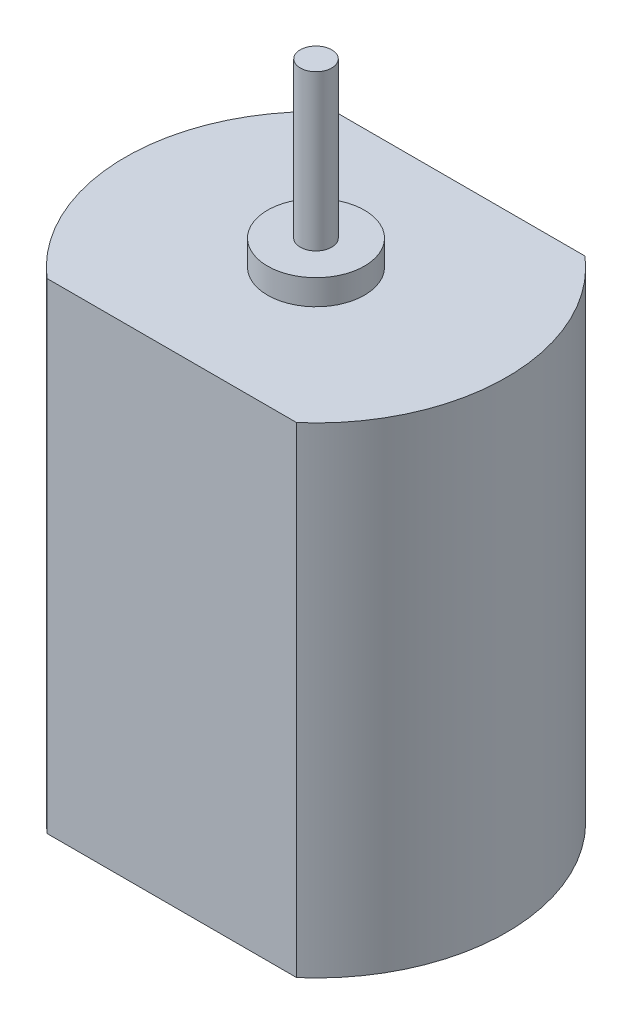
ISO-10303-21;
HEADER;
FILE_DESCRIPTION(('STEP AP214'),'2;1');
FILE_NAME('part.step','',(''),(''),'','','');
FILE_SCHEMA(('AUTOMOTIVE_DESIGN { 1 0 10303 214 1 1 1 1 }'));
ENDSEC;
DATA;
#1=APPLICATION_CONTEXT('core data for automotive mechanical design processes');
#2=APPLICATION_PROTOCOL_DEFINITION('international standard','automotive_design',2000,#1);
#3=PRODUCT_CONTEXT('',#1,'mechanical');
#4=PRODUCT('Part','Part','',(#3));
#5=PRODUCT_RELATED_PRODUCT_CATEGORY('part','',(#4));
#6=PRODUCT_DEFINITION_FORMATION('','',#4);
#7=PRODUCT_DEFINITION_CONTEXT('part definition',#1,'design');
#8=PRODUCT_DEFINITION('design','',#6,#7);
#9=PRODUCT_DEFINITION_SHAPE('','',#8);
#10=(LENGTH_UNIT() NAMED_UNIT(*) SI_UNIT(.MILLI.,.METRE.));
#11=(NAMED_UNIT(*) PLANE_ANGLE_UNIT() SI_UNIT($,.RADIAN.));
#12=(NAMED_UNIT(*) SI_UNIT($,.STERADIAN.) SOLID_ANGLE_UNIT());
#13=UNCERTAINTY_MEASURE_WITH_UNIT(LENGTH_MEASURE(1.E-05),#10,'distance_accuracy_value','');
#14=(GEOMETRIC_REPRESENTATION_CONTEXT(3) GLOBAL_UNCERTAINTY_ASSIGNED_CONTEXT((#13)) GLOBAL_UNIT_ASSIGNED_CONTEXT((#10,
#11,#12)) REPRESENTATION_CONTEXT('',''));
#15=CARTESIAN_POINT('',(0.,0.,0.));
#16=DIRECTION('',(0.,0.,1.));
#17=DIRECTION('',(1.,0.,0.));
#18=AXIS2_PLACEMENT_3D('',#15,#16,#17);
#19=CARTESIAN_POINT('',(0.,30.5,0.));
#20=DIRECTION('',(0.,-1.,0.));
#21=DIRECTION('',(0.,0.,-1.));
#22=AXIS2_PLACEMENT_3D('',#19,#20,#21);
#23=CYLINDRICAL_SURFACE('',#22,12.1);
#24=CARTESIAN_POINT('',(0.,0.,0.));
#25=DIRECTION('',(0.,1.,0.));
#26=DIRECTION('',(0.,0.,1.));
#27=AXIS2_PLACEMENT_3D('',#24,#25,#26);
#28=CIRCLE('',#27,12.1);
#29=CARTESIAN_POINT('',(7.91754381105656,0.,9.15));
#30=VERTEX_POINT('',#29);
#31=CARTESIAN_POINT('',(7.91754381105656,0.,-9.15));
#32=VERTEX_POINT('',#31);
#33=EDGE_CURVE('E106',#30,#32,#28,.T.);
#34=ORIENTED_EDGE('',*,*,#33,.T.);
#35=DIRECTION('',(0.,-1.,0.));
#36=VECTOR('',#35,1.);
#37=CARTESIAN_POINT('',(7.91754381105656,30.5,-9.15));
#38=LINE('',#37,#36);
#39=CARTESIAN_POINT('',(7.91754381105656,30.5,-9.15));
#40=VERTEX_POINT('',#39);
#41=EDGE_CURVE('E42',#40,#32,#38,.T.);
#42=ORIENTED_EDGE('',*,*,#41,.F.);
#43=CARTESIAN_POINT('',(0.,30.5,0.));
#44=DIRECTION('',(0.,1.,0.));
#45=DIRECTION('',(0.,0.,1.));
#46=AXIS2_PLACEMENT_3D('',#43,#44,#45);
#47=CIRCLE('',#46,12.1);
#48=CARTESIAN_POINT('',(7.91754381105656,30.5,9.15));
#49=VERTEX_POINT('',#48);
#50=EDGE_CURVE('E93',#49,#40,#47,.T.);
#51=ORIENTED_EDGE('',*,*,#50,.F.);
#52=DIRECTION('',(0.,-1.,0.));
#53=VECTOR('',#52,1.);
#54=CARTESIAN_POINT('',(7.91754381105656,30.5,9.15));
#55=LINE('',#54,#53);
#56=EDGE_CURVE('E102',#49,#30,#55,.T.);
#57=ORIENTED_EDGE('',*,*,#56,.T.);
#58=EDGE_LOOP('',(#34,#42,#51,#57));
#59=FACE_BOUND('',#58,.T.);
#60=ADVANCED_FACE('F39',(#59),#23,.T.);
#61=CARTESIAN_POINT('',(-7.91754381105656,30.5,-9.15));
#62=DIRECTION('',(0.,0.,1.));
#63=DIRECTION('',(1.,0.,0.));
#64=AXIS2_PLACEMENT_3D('',#61,#62,#63);
#65=PLANE('',#64);
#66=DIRECTION('',(-1.,0.,0.));
#67=VECTOR('',#66,1.);
#68=CARTESIAN_POINT('',(-7.91754381105656,0.,-9.15));
#69=LINE('',#68,#67);
#70=CARTESIAN_POINT('',(-7.91754381105656,0.,-9.15));
#71=VERTEX_POINT('',#70);
#72=EDGE_CURVE('E98',#32,#71,#69,.T.);
#73=ORIENTED_EDGE('',*,*,#72,.T.);
#74=DIRECTION('',(0.,-1.,0.));
#75=VECTOR('',#74,1.);
#76=CARTESIAN_POINT('',(-7.91754381105656,30.5,-9.15));
#77=LINE('',#76,#75);
#78=CARTESIAN_POINT('',(-7.91754381105656,30.5,-9.15));
#79=VERTEX_POINT('',#78);
#80=EDGE_CURVE('E96',#79,#71,#77,.T.);
#81=ORIENTED_EDGE('',*,*,#80,.F.);
#82=DIRECTION('',(-1.,0.,0.));
#83=VECTOR('',#82,1.);
#84=CARTESIAN_POINT('',(-7.91754381105656,30.5,-9.15));
#85=LINE('',#84,#83);
#86=EDGE_CURVE('E88',#40,#79,#85,.T.);
#87=ORIENTED_EDGE('',*,*,#86,.F.);
#88=ORIENTED_EDGE('',*,*,#41,.T.);
#89=EDGE_LOOP('',(#73,#81,#87,#88));
#90=FACE_BOUND('',#89,.T.);
#91=ADVANCED_FACE('F97',(#90),#65,.F.);
#92=CARTESIAN_POINT('',(0.,30.5,0.));
#93=DIRECTION('',(0.,-1.,0.));
#94=DIRECTION('',(0.,0.,-1.));
#95=AXIS2_PLACEMENT_3D('',#92,#93,#94);
#96=CYLINDRICAL_SURFACE('',#95,12.1);
#97=CARTESIAN_POINT('',(0.,0.,0.));
#98=DIRECTION('',(0.,1.,0.));
#99=DIRECTION('',(0.,0.,1.));
#100=AXIS2_PLACEMENT_3D('',#97,#98,#99);
#101=CIRCLE('',#100,12.1);
#102=CARTESIAN_POINT('',(-7.91754381105655,0.,9.15));
#103=VERTEX_POINT('',#102);
#104=EDGE_CURVE('E74',#71,#103,#101,.T.);
#105=ORIENTED_EDGE('',*,*,#104,.T.);
#106=DIRECTION('',(0.,-1.,0.));
#107=VECTOR('',#106,1.);
#108=CARTESIAN_POINT('',(-7.91754381105655,30.5,9.15));
#109=LINE('',#108,#107);
#110=CARTESIAN_POINT('',(-7.91754381105655,30.5,9.15));
#111=VERTEX_POINT('',#110);
#112=EDGE_CURVE('E99',#111,#103,#109,.T.);
#113=ORIENTED_EDGE('',*,*,#112,.F.);
#114=CARTESIAN_POINT('',(0.,30.5,0.));
#115=DIRECTION('',(0.,1.,0.));
#116=DIRECTION('',(0.,0.,1.));
#117=AXIS2_PLACEMENT_3D('',#114,#115,#116);
#118=CIRCLE('',#117,12.1);
#119=EDGE_CURVE('E91',#79,#111,#118,.T.);
#120=ORIENTED_EDGE('',*,*,#119,.F.);
#121=ORIENTED_EDGE('',*,*,#80,.T.);
#122=EDGE_LOOP('',(#105,#113,#120,#121));
#123=FACE_BOUND('',#122,.T.);
#124=ADVANCED_FACE('F100',(#123),#96,.T.);
#125=CARTESIAN_POINT('',(-7.91754381105656,30.5,9.15));
#126=DIRECTION('',(0.,0.,-1.));
#127=DIRECTION('',(-1.,0.,0.));
#128=AXIS2_PLACEMENT_3D('',#125,#126,#127);
#129=PLANE('',#128);
#130=DIRECTION('',(1.,0.,0.));
#131=VECTOR('',#130,1.);
#132=CARTESIAN_POINT('',(-7.91754381105656,0.,9.15));
#133=LINE('',#132,#131);
#134=EDGE_CURVE('E80',#103,#30,#133,.T.);
#135=ORIENTED_EDGE('',*,*,#134,.T.);
#136=ORIENTED_EDGE('',*,*,#56,.F.);
#137=DIRECTION('',(1.,0.,0.));
#138=VECTOR('',#137,1.);
#139=CARTESIAN_POINT('',(-7.91754381105656,30.5,9.15));
#140=LINE('',#139,#138);
#141=EDGE_CURVE('E57',#111,#49,#140,.T.);
#142=ORIENTED_EDGE('',*,*,#141,.F.);
#143=ORIENTED_EDGE('',*,*,#112,.T.);
#144=EDGE_LOOP('',(#135,#136,#142,#143));
#145=FACE_BOUND('',#144,.T.);
#146=ADVANCED_FACE('F114',(#145),#129,.F.);
#147=CARTESIAN_POINT('',(0.,30.5,0.));
#148=DIRECTION('',(0.,1.,0.));
#149=DIRECTION('',(0.,0.,1.));
#150=AXIS2_PLACEMENT_3D('',#147,#148,#149);
#151=PLANE('',#150);
#152=CARTESIAN_POINT('',(0.,30.5,0.));
#153=DIRECTION('',(0.,1.,0.));
#154=DIRECTION('',(0.,0.,1.));
#155=AXIS2_PLACEMENT_3D('',#152,#153,#154);
#156=CIRCLE('',#155,3.075);
#157=CARTESIAN_POINT('',(0.,30.5,3.075));
#158=VERTEX_POINT('',#157);
#159=EDGE_CURVE('E120',#158,#158,#156,.T.);
#160=ORIENTED_EDGE('',*,*,#159,.F.);
#161=EDGE_LOOP('',(#160));
#162=FACE_BOUND('',#161,.T.);
#163=ORIENTED_EDGE('',*,*,#50,.T.);
#164=ORIENTED_EDGE('',*,*,#86,.T.);
#165=ORIENTED_EDGE('',*,*,#119,.T.);
#166=ORIENTED_EDGE('',*,*,#141,.T.);
#167=EDGE_LOOP('',(#163,#164,#165,#166));
#168=FACE_BOUND('',#167,.T.);
#169=ADVANCED_FACE('F89',(#162,#168),#151,.T.);
#170=CARTESIAN_POINT('',(0.,0.,0.));
#171=DIRECTION('',(0.,1.,0.));
#172=DIRECTION('',(0.,0.,1.));
#173=AXIS2_PLACEMENT_3D('',#170,#171,#172);
#174=PLANE('',#173);
#175=CARTESIAN_POINT('',(0.,0.,0.));
#176=DIRECTION('',(0.,-1.,0.));
#177=DIRECTION('',(0.,0.,-1.));
#178=AXIS2_PLACEMENT_3D('',#175,#176,#177);
#179=CIRCLE('',#178,4.25);
#180=CARTESIAN_POINT('',(0.,0.,-4.25));
#181=VERTEX_POINT('',#180);
#182=EDGE_CURVE('E11',#181,#181,#179,.T.);
#183=ORIENTED_EDGE('',*,*,#182,.F.);
#184=EDGE_LOOP('',(#183));
#185=FACE_BOUND('',#184,.T.);
#186=ORIENTED_EDGE('',*,*,#33,.F.);
#187=ORIENTED_EDGE('',*,*,#134,.F.);
#188=ORIENTED_EDGE('',*,*,#104,.F.);
#189=ORIENTED_EDGE('',*,*,#72,.F.);
#190=EDGE_LOOP('',(#186,#187,#188,#189));
#191=FACE_BOUND('',#190,.T.);
#192=ADVANCED_FACE('F117',(#185,#191),#174,.F.);
#193=CARTESIAN_POINT('',(0.,32.1,0.));
#194=DIRECTION('',(0.,-1.,0.));
#195=DIRECTION('',(0.,0.,-1.));
#196=AXIS2_PLACEMENT_3D('',#193,#194,#195);
#197=CYLINDRICAL_SURFACE('',#196,3.075);
#198=CARTESIAN_POINT('',(0.,32.1,0.));
#199=DIRECTION('',(0.,1.,0.));
#200=DIRECTION('',(0.,0.,1.));
#201=AXIS2_PLACEMENT_3D('',#198,#199,#200);
#202=CIRCLE('',#201,3.075);
#203=CARTESIAN_POINT('',(0.,32.1,3.075));
#204=VERTEX_POINT('',#203);
#205=EDGE_CURVE('E109',#204,#204,#202,.T.);
#206=ORIENTED_EDGE('',*,*,#205,.F.);
#207=EDGE_LOOP('',(#206));
#208=FACE_BOUND('',#207,.T.);
#209=ORIENTED_EDGE('',*,*,#159,.T.);
#210=EDGE_LOOP('',(#209));
#211=FACE_BOUND('',#210,.T.);
#212=ADVANCED_FACE('F144',(#208,#211),#197,.T.);
#213=CARTESIAN_POINT('',(0.,32.1,0.));
#214=DIRECTION('',(0.,1.,0.));
#215=DIRECTION('',(0.,0.,1.));
#216=AXIS2_PLACEMENT_3D('',#213,#214,#215);
#217=PLANE('',#216);
#218=CARTESIAN_POINT('',(0.,32.1,0.));
#219=DIRECTION('',(0.,1.,0.));
#220=DIRECTION('',(0.,0.,1.));
#221=AXIS2_PLACEMENT_3D('',#218,#219,#220);
#222=CIRCLE('',#221,1.);
#223=CARTESIAN_POINT('',(0.,32.1,1.));
#224=VERTEX_POINT('',#223);
#225=EDGE_CURVE('E48',#224,#224,#222,.T.);
#226=ORIENTED_EDGE('',*,*,#225,.F.);
#227=EDGE_LOOP('',(#226));
#228=FACE_BOUND('',#227,.T.);
#229=ORIENTED_EDGE('',*,*,#205,.T.);
#230=EDGE_LOOP('',(#229));
#231=FACE_BOUND('',#230,.T.);
#232=ADVANCED_FACE('F150',(#228,#231),#217,.T.);
#233=CARTESIAN_POINT('',(0.,41.95,0.));
#234=DIRECTION('',(0.,-1.,0.));
#235=DIRECTION('',(0.,0.,-1.));
#236=AXIS2_PLACEMENT_3D('',#233,#234,#235);
#237=CYLINDRICAL_SURFACE('',#236,1.);
#238=CARTESIAN_POINT('',(0.,41.95,0.));
#239=DIRECTION('',(0.,1.,0.));
#240=DIRECTION('',(0.,0.,1.));
#241=AXIS2_PLACEMENT_3D('',#238,#239,#240);
#242=CIRCLE('',#241,1.);
#243=CARTESIAN_POINT('',(0.,41.95,1.));
#244=VERTEX_POINT('',#243);
#245=EDGE_CURVE('E125',#244,#244,#242,.T.);
#246=ORIENTED_EDGE('',*,*,#245,.F.);
#247=EDGE_LOOP('',(#246));
#248=FACE_BOUND('',#247,.T.);
#249=ORIENTED_EDGE('',*,*,#225,.T.);
#250=EDGE_LOOP('',(#249));
#251=FACE_BOUND('',#250,.T.);
#252=ADVANCED_FACE('F184',(#248,#251),#237,.T.);
#253=CARTESIAN_POINT('',(0.,41.95,0.));
#254=DIRECTION('',(0.,1.,0.));
#255=DIRECTION('',(0.,0.,1.));
#256=AXIS2_PLACEMENT_3D('',#253,#254,#255);
#257=PLANE('',#256);
#258=ORIENTED_EDGE('',*,*,#245,.T.);
#259=EDGE_LOOP('',(#258));
#260=FACE_BOUND('',#259,.T.);
#261=ADVANCED_FACE('F139',(#260),#257,.T.);
#262=CARTESIAN_POINT('',(0.,-2.,0.));
#263=DIRECTION('',(0.,1.,0.));
#264=DIRECTION('',(0.,0.,1.));
#265=AXIS2_PLACEMENT_3D('',#262,#263,#264);
#266=CYLINDRICAL_SURFACE('',#265,4.25);
#267=CARTESIAN_POINT('',(0.,-2.,0.));
#268=DIRECTION('',(0.,-1.,0.));
#269=DIRECTION('',(0.,0.,-1.));
#270=AXIS2_PLACEMENT_3D('',#267,#268,#269);
#271=CIRCLE('',#270,4.25);
#272=CARTESIAN_POINT('',(0.,-2.,-4.25));
#273=VERTEX_POINT('',#272);
#274=EDGE_CURVE('E129',#273,#273,#271,.T.);
#275=ORIENTED_EDGE('',*,*,#274,.F.);
#276=EDGE_LOOP('',(#275));
#277=FACE_BOUND('',#276,.T.);
#278=ORIENTED_EDGE('',*,*,#182,.T.);
#279=EDGE_LOOP('',(#278));
#280=FACE_BOUND('',#279,.T.);
#281=ADVANCED_FACE('F136',(#277,#280),#266,.T.);
#282=CARTESIAN_POINT('',(0.,-2.,0.));
#283=DIRECTION('',(0.,-1.,0.));
#284=DIRECTION('',(0.,0.,-1.));
#285=AXIS2_PLACEMENT_3D('',#282,#283,#284);
#286=PLANE('',#285);
#287=ORIENTED_EDGE('',*,*,#274,.T.);
#288=EDGE_LOOP('',(#287));
#289=FACE_BOUND('',#288,.T.);
#290=ADVANCED_FACE('F134',(#289),#286,.T.);
#291=CLOSED_SHELL('',(#60,#91,#124,#146,#169,#192,#212,#232,#252,#261,#281,#290));
#292=MANIFOLD_SOLID_BREP('B2',#291);
#293=ADVANCED_BREP_SHAPE_REPRESENTATION('',(#18,#292),#14);
#294=SHAPE_DEFINITION_REPRESENTATION(#9,#293);
ENDSEC;
END-ISO-10303-21;
